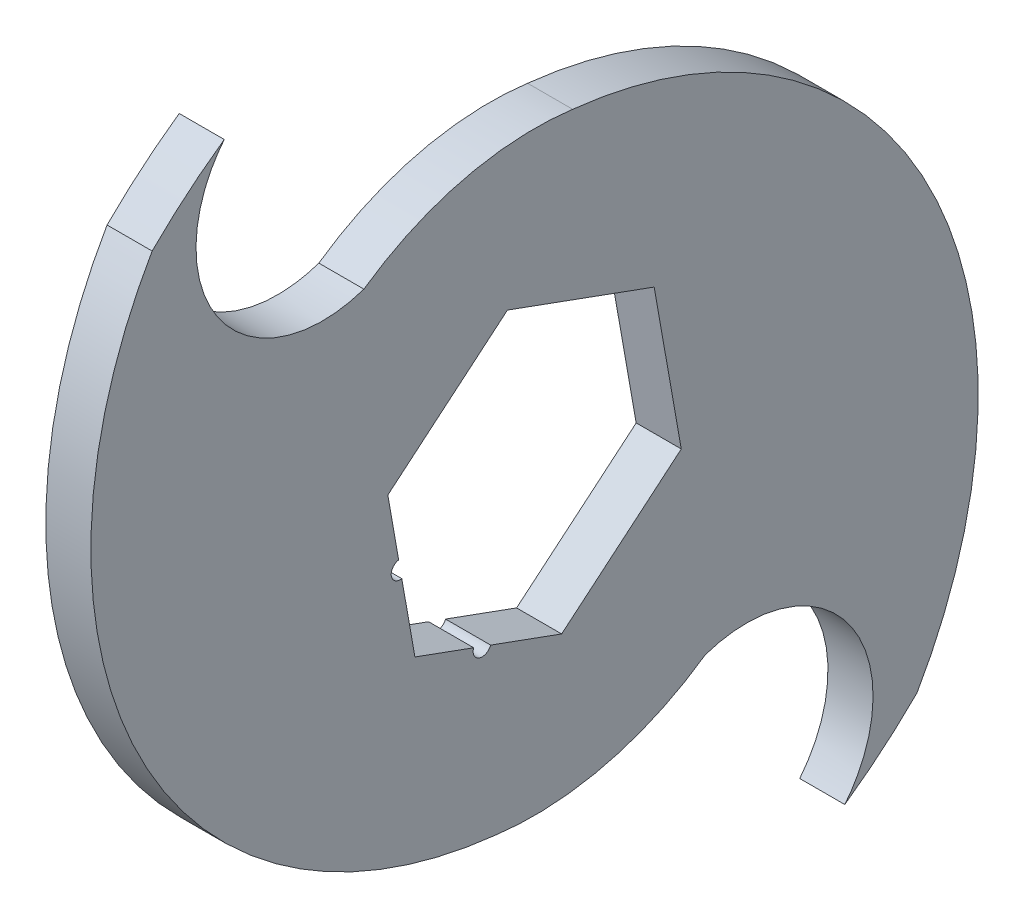
ISO-10303-21;
HEADER;
FILE_DESCRIPTION(('STEP AP214'),'2;1');
FILE_NAME('part.step','',(''),(''),'','','');
FILE_SCHEMA(('AUTOMOTIVE_DESIGN { 1 0 10303 214 1 1 1 1 }'));
ENDSEC;
DATA;
#1=APPLICATION_CONTEXT('core data for automotive mechanical design processes');
#2=APPLICATION_PROTOCOL_DEFINITION('international standard','automotive_design',2000,#1);
#3=PRODUCT_CONTEXT('',#1,'mechanical');
#4=PRODUCT('Part','Part','',(#3));
#5=PRODUCT_RELATED_PRODUCT_CATEGORY('part','',(#4));
#6=PRODUCT_DEFINITION_FORMATION('','',#4);
#7=PRODUCT_DEFINITION_CONTEXT('part definition',#1,'design');
#8=PRODUCT_DEFINITION('design','',#6,#7);
#9=PRODUCT_DEFINITION_SHAPE('','',#8);
#10=(LENGTH_UNIT() NAMED_UNIT(*) SI_UNIT(.MILLI.,.METRE.));
#11=(NAMED_UNIT(*) PLANE_ANGLE_UNIT() SI_UNIT($,.RADIAN.));
#12=(NAMED_UNIT(*) SI_UNIT($,.STERADIAN.) SOLID_ANGLE_UNIT());
#13=UNCERTAINTY_MEASURE_WITH_UNIT(LENGTH_MEASURE(1.E-05),#10,'distance_accuracy_value','');
#14=(GEOMETRIC_REPRESENTATION_CONTEXT(3) GLOBAL_UNCERTAINTY_ASSIGNED_CONTEXT((#13)) GLOBAL_UNIT_ASSIGNED_CONTEXT((#10,
#11,#12)) REPRESENTATION_CONTEXT('',''));
#15=CARTESIAN_POINT('',(0.,0.,0.));
#16=DIRECTION('',(0.,0.,1.));
#17=DIRECTION('',(1.,0.,0.));
#18=AXIS2_PLACEMENT_3D('',#15,#16,#17);
#19=CARTESIAN_POINT('',(-316.000000000001,130.92396265452,176.275953626987));
#20=DIRECTION('',(0.,-0.173648177666925,0.984807753012209));
#21=DIRECTION('',(0.,-0.984807753012209,-0.173648177666925));
#22=AXIS2_PLACEMENT_3D('',#19,#20,#21);
#23=PLANE('',#22);
#24=DIRECTION('',(0.,0.984807753012209,0.173648177666925));
#25=VECTOR('',#24,1.);
#26=CARTESIAN_POINT('',(-316.000000000001,-26.197122930176,148.571267000203));
#27=LINE('',#26,#25);
#28=CARTESIAN_POINT('',(-316.000000000001,113.866592015472,173.268278963379));
#29=VERTEX_POINT('',#28);
#30=CARTESIAN_POINT('',(-316.000000000001,122.122765386099,174.724065086027));
#31=VERTEX_POINT('',#30);
#32=EDGE_CURVE('E189',#29,#31,#27,.T.);
#33=ORIENTED_EDGE('',*,*,#32,.T.);
#34=DIRECTION('',(1.,0.,0.));
#35=VECTOR('',#34,1.);
#36=CARTESIAN_POINT('',(-316.000000000001,122.122765386099,174.724065086027));
#37=LINE('',#36,#35);
#38=CARTESIAN_POINT('',(-311.,122.122765386099,174.724065086027));
#39=VERTEX_POINT('',#38);
#40=EDGE_CURVE('E13',#31,#39,#37,.T.);
#41=ORIENTED_EDGE('',*,*,#40,.T.);
#42=DIRECTION('',(0.,-0.984807753012209,-0.173648177666925));
#43=VECTOR('',#42,1.);
#44=CARTESIAN_POINT('',(-311.,130.92396265452,176.275953626987));
#45=LINE('',#44,#43);
#46=CARTESIAN_POINT('',(-311.,113.866592015472,173.268278963379));
#47=VERTEX_POINT('',#46);
#48=EDGE_CURVE('E210',#39,#47,#45,.T.);
#49=ORIENTED_EDGE('',*,*,#48,.T.);
#50=DIRECTION('',(1.,0.,0.));
#51=VECTOR('',#50,1.);
#52=CARTESIAN_POINT('',(-316.000000000001,113.866592015472,173.268278963379));
#53=LINE('',#52,#51);
#54=EDGE_CURVE('E202',#29,#47,#53,.T.);
#55=ORIENTED_EDGE('',*,*,#54,.F.);
#56=EDGE_LOOP('',(#33,#41,#49,#55));
#57=FACE_BOUND('',#56,.T.);
#58=ADVANCED_FACE('F52',(#57),#23,.F.);
#59=CARTESIAN_POINT('',(-316.000000000001,113.866592015472,173.268278963379));
#60=DIRECTION('',(0.,-0.939692620785907,0.342020143325674));
#61=DIRECTION('',(0.,-0.342020143325674,-0.939692620785907));
#62=AXIS2_PLACEMENT_3D('',#59,#60,#61);
#63=PLANE('',#62);
#64=DIRECTION('',(0.,0.342020143325674,0.939692620785907));
#65=VECTOR('',#64,1.);
#66=CARTESIAN_POINT('',(-316.000000000001,44.8593796082233,-16.3274789050418));
#67=LINE('',#66,#65);
#68=CARTESIAN_POINT('',(-316.000000000001,107.942629360951,156.992325336392));
#69=VERTEX_POINT('',#68);
#70=CARTESIAN_POINT('',(-316.000000000001,110.809968281573,164.870274274724));
#71=VERTEX_POINT('',#70);
#72=EDGE_CURVE('E366',#69,#71,#67,.T.);
#73=ORIENTED_EDGE('',*,*,#72,.T.);
#74=DIRECTION('',(1.,0.,0.));
#75=VECTOR('',#74,1.);
#76=CARTESIAN_POINT('',(-316.000000000001,110.809968281573,164.870274274724));
#77=LINE('',#76,#75);
#78=CARTESIAN_POINT('',(-311.,110.809968281573,164.870274274724));
#79=VERTEX_POINT('',#78);
#80=EDGE_CURVE('E188',#71,#79,#77,.T.);
#81=ORIENTED_EDGE('',*,*,#80,.T.);
#82=DIRECTION('',(0.,-0.342020143325674,-0.939692620785906));
#83=VECTOR('',#82,1.);
#84=CARTESIAN_POINT('',(-311.,113.866592015472,173.268278963379));
#85=LINE('',#84,#83);
#86=CARTESIAN_POINT('',(-311.,107.942629360951,156.992325336392));
#87=VERTEX_POINT('',#86);
#88=EDGE_CURVE('E197',#79,#87,#85,.T.);
#89=ORIENTED_EDGE('',*,*,#88,.T.);
#90=DIRECTION('',(1.,0.,0.));
#91=VECTOR('',#90,1.);
#92=CARTESIAN_POINT('',(-316.000000000001,107.942629360951,156.992325336392));
#93=LINE('',#92,#91);
#94=EDGE_CURVE('E234',#69,#87,#93,.T.);
#95=ORIENTED_EDGE('',*,*,#94,.F.);
#96=EDGE_LOOP('',(#73,#81,#89,#95));
#97=FACE_BOUND('',#96,.T.);
#98=ADVANCED_FACE('F480',(#97),#63,.F.);
#99=CARTESIAN_POINT('',(-316.,93.3772128220975,225.039789292819));
#100=CARTESIAN_POINT('',(-316.,73.0393821844405,109.698220147012));
#101=CARTESIAN_POINT('',(-316.,176.96061781556,210.301779852989));
#102=CARTESIAN_POINT('',(-316.,156.622787177903,94.9602107071821));
#103=(BOUNDED_SURFACE() B_SPLINE_SURFACE(1,1,((#99,#100),(#101,#102)),.UNSPECIFIED.,.F.,.F.,
.F.) B_SPLINE_SURFACE_WITH_KNOTS((2,2),(2,2),(-4.53981220711867,3.94746916711987),
(-5.85604493836555,5.85604493836564),
.UNSPECIFIED.) GEOMETRIC_REPRESENTATION_ITEM() RATIONAL_B_SPLINE_SURFACE(((1.,1.),(1.,1.))) REPRESENTATION_ITEM('') SURFACE());
#104=DIRECTION('',(0.,0.642787609686532,-0.766044443118984));
#105=VECTOR('',#104,1.);
#106=CARTESIAN_POINT('',(-316.000000000001,163.628297991945,137.300444495205));
#107=LINE('',#106,#105);
#108=CARTESIAN_POINT('',(-316.000000000001,130.92396265452,176.275953626987));
#109=VERTEX_POINT('',#108);
#110=CARTESIAN_POINT('',(-316.000000000001,142.057370639048,163.007674663609));
#111=VERTEX_POINT('',#110);
#112=EDGE_CURVE('E456',#109,#111,#107,.T.);
#113=DIRECTION('',(0.,-0.984807753012209,-0.173648177666925));
#114=VECTOR('',#113,1.);
#115=CARTESIAN_POINT('',(-316.000000000001,130.92396265452,176.275953626987));
#116=LINE('',#115,#114);
#117=CARTESIAN_POINT('',(-316.000000000001,124.092380892124,175.071361441361));
#118=VERTEX_POINT('',#117);
#119=EDGE_CURVE('E69',#109,#118,#116,.T.);
#120=CARTESIAN_POINT('',(-316.000000000001,123.107573139112,174.897713263694));
#121=DIRECTION('',(1.,0.,0.));
#122=DIRECTION('',(0.,1.,0.));
#123=AXIS2_PLACEMENT_3D('',#120,#121,#122);
#124=CIRCLE('',#123,0.999999999999998);
#125=EDGE_CURVE('E469',#118,#31,#124,.T.);
#126=DIRECTION('',(0.,-0.342020143325674,-0.939692620785906));
#127=VECTOR('',#126,1.);
#128=CARTESIAN_POINT('',(-316.000000000001,113.866592015472,173.268278963379));
#129=LINE('',#128,#127);
#130=CARTESIAN_POINT('',(-316.000000000001,111.494008568225,166.749659516296));
#131=VERTEX_POINT('',#130);
#132=EDGE_CURVE('E76',#29,#131,#129,.T.);
#133=CARTESIAN_POINT('',(-316.000000000001,111.151988424899,165.80996689551));
#134=DIRECTION('',(1.,0.,0.));
#135=DIRECTION('',(0.,1.,0.));
#136=AXIS2_PLACEMENT_3D('',#133,#134,#135);
#137=CIRCLE('',#136,0.999999999999998);
#138=EDGE_CURVE('E185',#131,#71,#137,.T.);
#139=DIRECTION('',(0.,-0.642787609686533,0.766044443118983));
#140=VECTOR('',#139,1.);
#141=CARTESIAN_POINT('',(-316.000000000001,140.646964698376,118.01681620461));
#142=LINE('',#141,#140);
#143=CARTESIAN_POINT('',(-316.000000000001,119.076037345479,143.724046373014));
#144=VERTEX_POINT('',#143);
#145=EDGE_CURVE('E450',#144,#69,#142,.T.);
#146=DIRECTION('',(0.,-0.984807753012208,-0.17364817766693));
#147=VECTOR('',#146,1.);
#148=CARTESIAN_POINT('',(-316.000000000001,-20.987677600169,119.027034409837));
#149=LINE('',#148,#147);
#150=CARTESIAN_POINT('',(-316.000000000001,136.133407984528,146.731721036622));
#151=VERTEX_POINT('',#150);
#152=EDGE_CURVE('E452',#151,#144,#149,.T.);
#153=DIRECTION('',(0.,-0.342020143325667,-0.939692620785909));
#154=VECTOR('',#153,1.);
#155=CARTESIAN_POINT('',(-316.000000000001,73.050158231801,-26.5880832048116));
#156=LINE('',#155,#154);
#157=EDGE_CURVE('E454',#111,#151,#156,.T.);
#158=CARTESIAN_POINT('',(-316.,92.2723523249579,164.230966515857));
#159=CARTESIAN_POINT('',(-316.,95.1197558353693,191.394339036595));
#160=CARTESIAN_POINT('',(-316.,119.469886618919,203.764773316586));
#161=CARTESIAN_POINT('',(-316.,143.820017402468,216.135207596576));
#162=CARTESIAN_POINT('',(-316.,167.436635888117,202.416175387457));
#163=(BOUNDED_CURVE() B_SPLINE_CURVE(2,(#158,#159,#160,#161,#162),.UNSPECIFIED.,.F.,
.F.) B_SPLINE_CURVE_WITH_KNOTS((3,2,3),(0.,0.996307011316955,1.99261402263391),
.UNSPECIFIED.) CURVE() GEOMETRIC_REPRESENTATION_ITEM() RATIONAL_B_SPLINE_CURVE((1.,
0.878466321854941,1.,0.878466321854941,1.)) REPRESENTATION_ITEM(''));
#164=CARTESIAN_POINT('',(-316.,92.2723523249579,164.230966515857));
#165=VERTEX_POINT('',#164);
#166=CARTESIAN_POINT('',(-316.,167.436635888117,202.416175387457));
#167=VERTEX_POINT('',#166);
#168=EDGE_CURVE('E357',#165,#167,#163,.T.);
#169=CARTESIAN_POINT('',(-316.,167.436635888117,202.416175387457));
#170=CARTESIAN_POINT('',(-316.,171.142417404228,198.708606295157));
#171=CARTESIAN_POINT('',(-316.,174.14912265734,194.414586181064));
#172=(BOUNDED_CURVE() B_SPLINE_CURVE(2,(#169,#170,#171),.UNSPECIFIED.,.F.,
.F.) B_SPLINE_CURVE_WITH_KNOTS((3,3),(-0.959689959281828,-0.785398163397448),
.UNSPECIFIED.) CURVE() GEOMETRIC_REPRESENTATION_ITEM() RATIONAL_B_SPLINE_CURVE((1.,
0.996205198753708,1.)) REPRESENTATION_ITEM(''));
#173=CARTESIAN_POINT('',(-316.,174.14912265734,194.414586181064));
#174=VERTEX_POINT('',#173);
#175=EDGE_CURVE('E294',#167,#174,#172,.T.);
#176=CARTESIAN_POINT('',(-316.,174.14912265734,194.414586181064));
#177=CARTESIAN_POINT('',(-316.,165.924980514249,201.084641941576));
#178=CARTESIAN_POINT('',(-316.,157.251009035956,195.01106172626));
#179=CARTESIAN_POINT('',(-316.,148.577037557664,188.937481510943));
#180=CARTESIAN_POINT('',(-316.,152.032017461537,178.928022399585));
#181=(BOUNDED_CURVE() B_SPLINE_CURVE(2,(#176,#177,#178,#179,#180),.UNSPECIFIED.,.F.,
.F.) B_SPLINE_CURVE_WITH_KNOTS((3,2,3),(-2.5845957593549,-1.29229787967745,0.),
.UNSPECIFIED.) CURVE() GEOMETRIC_REPRESENTATION_ITEM() RATIONAL_B_SPLINE_CURVE((1.,
0.798408498827068,1.,0.798408498827074,1.)) REPRESENTATION_ITEM(''));
#182=CARTESIAN_POINT('',(-316.,152.032017461537,178.928022399585));
#183=VERTEX_POINT('',#182);
#184=EDGE_CURVE('E285',#174,#183,#181,.T.);
#185=CARTESIAN_POINT('',(-316.,152.032017461537,178.928022399585));
#186=CARTESIAN_POINT('',(-316.,159.367297201495,168.452157260068));
#187=CARTESIAN_POINT('',(-316.,157.727647675044,155.769033484153));
#188=(BOUNDED_CURVE() B_SPLINE_CURVE(2,(#185,#186,#187),.UNSPECIFIED.,.F.,
.F.) B_SPLINE_CURVE_WITH_KNOTS((3,3),(-0.785398163397448,-0.0459679370742319),
.UNSPECIFIED.) CURVE() GEOMETRIC_REPRESENTATION_ITEM() RATIONAL_B_SPLINE_CURVE((1.,
0.932430327247687,1.)) REPRESENTATION_ITEM(''));
#189=CARTESIAN_POINT('',(-316.,157.727647675044,155.769033484153));
#190=VERTEX_POINT('',#189);
#191=EDGE_CURVE('E284',#183,#190,#188,.T.);
#192=CARTESIAN_POINT('',(-315.999999999999,157.727647675044,155.769033484153));
#193=CARTESIAN_POINT('',(-315.999999999999,154.880244164636,128.605660963411));
#194=CARTESIAN_POINT('',(-316.,130.530113381086,116.235226683418));
#195=CARTESIAN_POINT('',(-316.,106.179982597535,103.864792403424));
#196=CARTESIAN_POINT('',(-316.000000000001,82.5633641118844,117.583824612545));
#197=(BOUNDED_CURVE() B_SPLINE_CURVE(2,(#192,#193,#194,#195,#196),.UNSPECIFIED.,.F.,
.F.) B_SPLINE_CURVE_WITH_KNOTS((3,2,3),(-1.53135584032607E-13,0.996307011316879,
1.99261402263391),
.UNSPECIFIED.) CURVE() GEOMETRIC_REPRESENTATION_ITEM() RATIONAL_B_SPLINE_CURVE((1.,
0.878466321854923,1.,0.878466321854924,1.)) REPRESENTATION_ITEM(''));
#198=CARTESIAN_POINT('',(-316.,82.5633641118844,117.583824612545));
#199=VERTEX_POINT('',#198);
#200=EDGE_CURVE('E265',#190,#199,#197,.T.);
#201=CARTESIAN_POINT('',(-316.000000000001,82.5633641118844,117.583824612545));
#202=CARTESIAN_POINT('',(-316.000000000001,78.8575825957731,121.291393704845));
#203=CARTESIAN_POINT('',(-316.000000000001,75.8508773426607,125.585413818938));
#204=(BOUNDED_CURVE() B_SPLINE_CURVE(2,(#201,#202,#203),.UNSPECIFIED.,.F.,
.F.) B_SPLINE_CURVE_WITH_KNOTS((3,3),(-0.959689959281827,-0.785398163397448),
.UNSPECIFIED.) CURVE() GEOMETRIC_REPRESENTATION_ITEM() RATIONAL_B_SPLINE_CURVE((1.,
0.996205198753625,1.)) REPRESENTATION_ITEM(''));
#205=CARTESIAN_POINT('',(-316.,75.8508773426607,125.585413818938));
#206=VERTEX_POINT('',#205);
#207=EDGE_CURVE('E244',#199,#206,#204,.T.);
#208=CARTESIAN_POINT('',(-316.000000000001,75.8508773426607,125.585413818938));
#209=CARTESIAN_POINT('',(-316.000000000001,84.0750194857523,118.915358058425));
#210=CARTESIAN_POINT('',(-316.000000000001,92.7489909640453,124.988938273742));
#211=CARTESIAN_POINT('',(-316.,101.422962442337,131.062518489058));
#212=CARTESIAN_POINT('',(-316.,97.967982538464,141.071977600416));
#213=(BOUNDED_CURVE() B_SPLINE_CURVE(2,(#208,#209,#210,#211,#212),.UNSPECIFIED.,.F.,
.F.) B_SPLINE_CURVE_WITH_KNOTS((3,2,3),(-2.5845957593549,-1.29229787967746,0.),
.UNSPECIFIED.) CURVE() GEOMETRIC_REPRESENTATION_ITEM() RATIONAL_B_SPLINE_CURVE((1.,
0.798408498827071,1.,0.798408498827066,1.)) REPRESENTATION_ITEM(''));
#214=CARTESIAN_POINT('',(-316.,97.967982538464,141.071977600416));
#215=VERTEX_POINT('',#214);
#216=EDGE_CURVE('E238',#206,#215,#213,.T.);
#217=CARTESIAN_POINT('',(-316.,97.967982538464,141.071977600416));
#218=CARTESIAN_POINT('',(-316.,90.6327027985029,151.547842739937));
#219=CARTESIAN_POINT('',(-316.,92.2723523249579,164.230966515857));
#220=(BOUNDED_CURVE() B_SPLINE_CURVE(2,(#217,#218,#219),.UNSPECIFIED.,.F.,
.F.) B_SPLINE_CURVE_WITH_KNOTS((3,3),(2.35619449019233,3.09562471651579),
.UNSPECIFIED.) CURVE() GEOMETRIC_REPRESENTATION_ITEM() RATIONAL_B_SPLINE_CURVE((1.,
0.932430327247634,1.)) REPRESENTATION_ITEM(''));
#221=EDGE_CURVE('E245',#215,#165,#220,.T.);
#222=ORIENTED_EDGE('',*,*,#112,.F.);
#223=ORIENTED_EDGE('',*,*,#119,.T.);
#224=ORIENTED_EDGE('',*,*,#125,.T.);
#225=ORIENTED_EDGE('',*,*,#32,.F.);
#226=ORIENTED_EDGE('',*,*,#132,.T.);
#227=ORIENTED_EDGE('',*,*,#138,.T.);
#228=ORIENTED_EDGE('',*,*,#72,.F.);
#229=ORIENTED_EDGE('',*,*,#145,.F.);
#230=ORIENTED_EDGE('',*,*,#152,.F.);
#231=ORIENTED_EDGE('',*,*,#157,.F.);
#232=EDGE_LOOP('',(#222,#223,#224,#225,#226,#227,#228,#229,#230,#231));
#233=FACE_BOUND('',#232,.T.);
#234=ORIENTED_EDGE('',*,*,#168,.T.);
#235=ORIENTED_EDGE('',*,*,#175,.T.);
#236=ORIENTED_EDGE('',*,*,#184,.T.);
#237=ORIENTED_EDGE('',*,*,#191,.T.);
#238=ORIENTED_EDGE('',*,*,#200,.T.);
#239=ORIENTED_EDGE('',*,*,#207,.T.);
#240=ORIENTED_EDGE('',*,*,#216,.T.);
#241=ORIENTED_EDGE('',*,*,#221,.T.);
#242=EDGE_LOOP('',(#234,#235,#236,#237,#238,#239,#240,#241));
#243=FACE_BOUND('',#242,.T.);
#244=ADVANCED_FACE('F475',(#233,#243),#103,.T.);
#245=CARTESIAN_POINT('',(-311.,176.96061781556,210.301779852989));
#246=CARTESIAN_POINT('',(-311.,156.622787177903,94.9602107071829));
#247=CARTESIAN_POINT('',(-311.,93.3772128220975,225.039789292819));
#248=CARTESIAN_POINT('',(-311.,73.0393821844406,109.698220147013));
#249=(BOUNDED_SURFACE() B_SPLINE_SURFACE(1,1,((#245,#246),(#247,#248)),.UNSPECIFIED.,.F.,.F.,
.F.) B_SPLINE_SURFACE_WITH_KNOTS((2,2),(2,2),(-4.53981220711868,3.94746916711987),
(-5.85604493836555,5.85604493836555),
.UNSPECIFIED.) GEOMETRIC_REPRESENTATION_ITEM() RATIONAL_B_SPLINE_SURFACE(((1.,1.),(1.,1.))) REPRESENTATION_ITEM('') SURFACE());
#250=CARTESIAN_POINT('',(-311.,111.494008568225,166.749659516296));
#251=VERTEX_POINT('',#250);
#252=EDGE_CURVE('E194',#47,#251,#85,.T.);
#253=CARTESIAN_POINT('',(-311.,123.107573139112,174.897713263694));
#254=DIRECTION('',(1.,0.,0.));
#255=DIRECTION('',(0.,1.,0.));
#256=AXIS2_PLACEMENT_3D('',#253,#254,#255);
#257=CIRCLE('',#256,0.999999999999998);
#258=CARTESIAN_POINT('',(-311.,124.092380892124,175.071361441361));
#259=VERTEX_POINT('',#258);
#260=EDGE_CURVE('E468',#259,#39,#257,.T.);
#261=CARTESIAN_POINT('',(-311.,130.92396265452,176.275953626987));
#262=VERTEX_POINT('',#261);
#263=EDGE_CURVE('E208',#262,#259,#45,.T.);
#264=DIRECTION('',(0.,-0.642787609686532,0.766044443118984));
#265=VECTOR('',#264,1.);
#266=CARTESIAN_POINT('',(-311.,142.057370639048,163.007674663609));
#267=LINE('',#266,#265);
#268=CARTESIAN_POINT('',(-311.,142.057370639048,163.007674663609));
#269=VERTEX_POINT('',#268);
#270=EDGE_CURVE('E218',#269,#262,#267,.T.);
#271=DIRECTION('',(0.,0.342020143325667,0.939692620785909));
#272=VECTOR('',#271,1.);
#273=CARTESIAN_POINT('',(-311.,136.133407984528,146.731721036622));
#274=LINE('',#273,#272);
#275=CARTESIAN_POINT('',(-311.,136.133407984528,146.731721036622));
#276=VERTEX_POINT('',#275);
#277=EDGE_CURVE('E215',#276,#269,#274,.T.);
#278=DIRECTION('',(0.,0.984807753012208,0.17364817766693));
#279=VECTOR('',#278,1.);
#280=CARTESIAN_POINT('',(-311.,119.076037345479,143.724046373014));
#281=LINE('',#280,#279);
#282=CARTESIAN_POINT('',(-311.,119.076037345479,143.724046373014));
#283=VERTEX_POINT('',#282);
#284=EDGE_CURVE('E206',#283,#276,#281,.T.);
#285=DIRECTION('',(0.,0.642787609686533,-0.766044443118983));
#286=VECTOR('',#285,1.);
#287=CARTESIAN_POINT('',(-311.,107.942629360951,156.992325336392));
#288=LINE('',#287,#286);
#289=EDGE_CURVE('E203',#87,#283,#288,.T.);
#290=CARTESIAN_POINT('',(-311.,111.151988424899,165.80996689551));
#291=DIRECTION('',(1.,0.,0.));
#292=DIRECTION('',(0.,1.,0.));
#293=AXIS2_PLACEMENT_3D('',#290,#291,#292);
#294=CIRCLE('',#293,0.999999999999998);
#295=EDGE_CURVE('E183',#251,#79,#294,.T.);
#296=CARTESIAN_POINT('',(-311.,152.032017461537,178.928022399585));
#297=CARTESIAN_POINT('',(-311.,148.577037557664,188.937481510943));
#298=CARTESIAN_POINT('',(-311.,157.251009035956,195.01106172626));
#299=CARTESIAN_POINT('',(-311.,165.924980514249,201.084641941576));
#300=CARTESIAN_POINT('',(-311.,174.14912265734,194.414586181064));
#301=(BOUNDED_CURVE() B_SPLINE_CURVE(2,(#296,#297,#298,#299,#300),.UNSPECIFIED.,.F.,
.F.) B_SPLINE_CURVE_WITH_KNOTS((3,2,3),(0.,1.29229787967745,2.5845957593549),
.UNSPECIFIED.) CURVE() GEOMETRIC_REPRESENTATION_ITEM() RATIONAL_B_SPLINE_CURVE((1.,
0.798408498827073,1.,0.798408498827067,1.)) REPRESENTATION_ITEM(''));
#302=CARTESIAN_POINT('',(-311.,152.032017461537,178.928022399585));
#303=VERTEX_POINT('',#302);
#304=CARTESIAN_POINT('',(-311.,174.14912265734,194.414586181064));
#305=VERTEX_POINT('',#304);
#306=EDGE_CURVE('E266',#303,#305,#301,.T.);
#307=CARTESIAN_POINT('',(-311.,167.436635888117,202.416175387457));
#308=CARTESIAN_POINT('',(-311.,171.142417404228,198.708606295157));
#309=CARTESIAN_POINT('',(-311.,174.14912265734,194.414586181064));
#310=(BOUNDED_CURVE() B_SPLINE_CURVE(2,(#307,#308,#309),.UNSPECIFIED.,.F.,
.F.) B_SPLINE_CURVE_WITH_KNOTS((3,3),(-0.959689959281828,-0.785398163397448),
.UNSPECIFIED.) CURVE() GEOMETRIC_REPRESENTATION_ITEM() RATIONAL_B_SPLINE_CURVE((1.,
0.996205198753708,1.)) REPRESENTATION_ITEM(''));
#311=CARTESIAN_POINT('',(-311.,167.436635888117,202.416175387457));
#312=VERTEX_POINT('',#311);
#313=EDGE_CURVE('E330',#312,#305,#310,.T.);
#314=CARTESIAN_POINT('',(-311.,92.2723523249579,164.230966515857));
#315=CARTESIAN_POINT('',(-311.,95.1197558353693,191.394339036595));
#316=CARTESIAN_POINT('',(-311.,119.469886618919,203.764773316586));
#317=CARTESIAN_POINT('',(-311.,143.820017402468,216.135207596576));
#318=CARTESIAN_POINT('',(-311.,167.436635888117,202.416175387457));
#319=(BOUNDED_CURVE() B_SPLINE_CURVE(2,(#314,#315,#316,#317,#318),.UNSPECIFIED.,.F.,
.F.) B_SPLINE_CURVE_WITH_KNOTS((3,2,3),(0.,0.996307011316955,1.99261402263391),
.UNSPECIFIED.) CURVE() GEOMETRIC_REPRESENTATION_ITEM() RATIONAL_B_SPLINE_CURVE((1.,
0.878466321854941,1.,0.878466321854941,1.)) REPRESENTATION_ITEM(''));
#320=CARTESIAN_POINT('',(-311.,92.2723523249579,164.230966515857));
#321=VERTEX_POINT('',#320);
#322=EDGE_CURVE('E295',#321,#312,#319,.T.);
#323=CARTESIAN_POINT('',(-311.,97.9679825384637,141.071977600416));
#324=CARTESIAN_POINT('',(-311.,90.6327027985031,151.547842739937));
#325=CARTESIAN_POINT('',(-311.,92.2723523249579,164.230966515857));
#326=(BOUNDED_CURVE() B_SPLINE_CURVE(2,(#323,#324,#325),.UNSPECIFIED.,.F.,
.F.) B_SPLINE_CURVE_WITH_KNOTS((3,3),(2.35619449019234,3.09562471651579),
.UNSPECIFIED.) CURVE() GEOMETRIC_REPRESENTATION_ITEM() RATIONAL_B_SPLINE_CURVE((1.,
0.932430327247639,1.)) REPRESENTATION_ITEM(''));
#327=CARTESIAN_POINT('',(-311.,97.9679825384638,141.071977600416));
#328=VERTEX_POINT('',#327);
#329=EDGE_CURVE('E256',#328,#321,#326,.T.);
#330=CARTESIAN_POINT('',(-311.,97.9679825384638,141.071977600416));
#331=CARTESIAN_POINT('',(-311.,101.422962442337,131.062518489058));
#332=CARTESIAN_POINT('',(-311.,92.7489909640453,124.988938273742));
#333=CARTESIAN_POINT('',(-311.,84.0750194857524,118.915358058425));
#334=CARTESIAN_POINT('',(-311.000000000001,75.8508773426607,125.585413818938));
#335=(BOUNDED_CURVE() B_SPLINE_CURVE(2,(#330,#331,#332,#333,#334),.UNSPECIFIED.,.F.,
.F.) B_SPLINE_CURVE_WITH_KNOTS((3,2,3),(0.,1.29229787967745,2.5845957593549),
.UNSPECIFIED.) CURVE() GEOMETRIC_REPRESENTATION_ITEM() RATIONAL_B_SPLINE_CURVE((1.,
0.798408498827074,1.,0.79840849882707,1.)) REPRESENTATION_ITEM(''));
#336=CARTESIAN_POINT('',(-311.000000000001,75.8508773426607,125.585413818938));
#337=VERTEX_POINT('',#336);
#338=EDGE_CURVE('E275',#328,#337,#335,.T.);
#339=CARTESIAN_POINT('',(-311.,82.5633641118844,117.583824612545));
#340=CARTESIAN_POINT('',(-311.000000000001,78.8575825957729,121.291393704845));
#341=CARTESIAN_POINT('',(-311.000000000001,75.8508773426607,125.585413818938));
#342=(BOUNDED_CURVE() B_SPLINE_CURVE(2,(#339,#340,#341),.UNSPECIFIED.,.F.,
.F.) B_SPLINE_CURVE_WITH_KNOTS((3,3),(-0.959689959281828,-0.785398163397448),
.UNSPECIFIED.) CURVE() GEOMETRIC_REPRESENTATION_ITEM() RATIONAL_B_SPLINE_CURVE((1.,
0.996205198753724,1.)) REPRESENTATION_ITEM(''));
#343=CARTESIAN_POINT('',(-311.,82.5633641118844,117.583824612545));
#344=VERTEX_POINT('',#343);
#345=EDGE_CURVE('E341',#344,#337,#342,.T.);
#346=CARTESIAN_POINT('',(-310.999999999999,157.727647675043,155.769033484145));
#347=CARTESIAN_POINT('',(-310.999999999999,154.880244164631,128.605660963407));
#348=CARTESIAN_POINT('',(-310.999999999999,130.530113381082,116.235226683416));
#349=CARTESIAN_POINT('',(-311.,106.179982597533,103.864792403426));
#350=CARTESIAN_POINT('',(-311.,82.5633641118844,117.583824612545));
#351=(BOUNDED_CURVE() B_SPLINE_CURVE(2,(#346,#347,#348,#349,#350),.UNSPECIFIED.,.F.,
.F.) B_SPLINE_CURVE_WITH_KNOTS((3,2,3),(0.,0.996307011316955,1.99261402263391),
.UNSPECIFIED.) CURVE() GEOMETRIC_REPRESENTATION_ITEM() RATIONAL_B_SPLINE_CURVE((1.,
0.878466321854942,1.,0.878466321854944,1.)) REPRESENTATION_ITEM(''));
#352=CARTESIAN_POINT('',(-310.999999999999,157.727647675043,155.769033484145));
#353=VERTEX_POINT('',#352);
#354=EDGE_CURVE('E389',#353,#344,#351,.T.);
#355=CARTESIAN_POINT('',(-311.,152.032017461537,178.928022399585));
#356=CARTESIAN_POINT('',(-311.,159.367297201498,168.452157260065));
#357=CARTESIAN_POINT('',(-311.,157.727647675043,155.769033484145));
#358=(BOUNDED_CURVE() B_SPLINE_CURVE(2,(#355,#356,#357),.UNSPECIFIED.,.F.,
.F.) B_SPLINE_CURVE_WITH_KNOTS((3,3),(-0.785398163397448,-0.0459679370739997),
.UNSPECIFIED.) CURVE() GEOMETRIC_REPRESENTATION_ITEM() RATIONAL_B_SPLINE_CURVE((1.,
0.932430327247638,1.)) REPRESENTATION_ITEM(''));
#359=EDGE_CURVE('E340',#303,#353,#358,.T.);
#360=ORIENTED_EDGE('',*,*,#252,.F.);
#361=ORIENTED_EDGE('',*,*,#48,.F.);
#362=ORIENTED_EDGE('',*,*,#260,.F.);
#363=ORIENTED_EDGE('',*,*,#263,.F.);
#364=ORIENTED_EDGE('',*,*,#270,.F.);
#365=ORIENTED_EDGE('',*,*,#277,.F.);
#366=ORIENTED_EDGE('',*,*,#284,.F.);
#367=ORIENTED_EDGE('',*,*,#289,.F.);
#368=ORIENTED_EDGE('',*,*,#88,.F.);
#369=ORIENTED_EDGE('',*,*,#295,.F.);
#370=EDGE_LOOP('',(#360,#361,#362,#363,#364,#365,#366,#367,#368,#369));
#371=FACE_BOUND('',#370,.T.);
#372=ORIENTED_EDGE('',*,*,#306,.T.);
#373=ORIENTED_EDGE('',*,*,#313,.F.);
#374=ORIENTED_EDGE('',*,*,#322,.F.);
#375=ORIENTED_EDGE('',*,*,#329,.F.);
#376=ORIENTED_EDGE('',*,*,#338,.T.);
#377=ORIENTED_EDGE('',*,*,#345,.F.);
#378=ORIENTED_EDGE('',*,*,#354,.F.);
#379=ORIENTED_EDGE('',*,*,#359,.F.);
#380=EDGE_LOOP('',(#372,#373,#374,#375,#376,#377,#378,#379));
#381=FACE_BOUND('',#380,.T.);
#382=ADVANCED_FACE('F192',(#371,#381),#249,.T.);
#383=CARTESIAN_POINT('',(-311.,97.9679825384638,141.071977600416));
#384=CARTESIAN_POINT('',(-311.,101.422962442337,131.062518489059));
#385=CARTESIAN_POINT('',(-311.,92.7489909640453,124.988938273742));
#386=CARTESIAN_POINT('',(-311.,84.0750194857523,118.915358058425));
#387=CARTESIAN_POINT('',(-311.000000000001,75.8508773426607,125.585413818938));
#388=CARTESIAN_POINT('',(-316.000000000001,97.9679825384639,141.071977600416));
#389=CARTESIAN_POINT('',(-316.,101.422962442338,131.062518489059));
#390=CARTESIAN_POINT('',(-316.000000000001,92.7489909640453,124.988938273742));
#391=CARTESIAN_POINT('',(-316.000000000001,84.0750194857523,118.915358058425));
#392=CARTESIAN_POINT('',(-316.000000000001,75.8508773426607,125.585413818938));
#393=(BOUNDED_SURFACE() B_SPLINE_SURFACE(1,2,((#383,#384,#385,#386,#387),(#388,#389,#390,#391,
#392)),.UNSPECIFIED.,.F.,.F.,.F.) B_SPLINE_SURFACE_WITH_KNOTS((2,2),(3,2,3),(0.,
0.356099747166173),(0.,1.29229787967745,2.5845957593549),
.UNSPECIFIED.) GEOMETRIC_REPRESENTATION_ITEM() RATIONAL_B_SPLINE_SURFACE(((1.,0.798408498827072,
1.,0.798408498827072,1.),(1.,0.798408498827072,1.,0.798408498827072,1.))) REPRESENTATION_ITEM('') SURFACE());
#394=CARTESIAN_POINT('',(-316.,97.967982538464,141.071977600416));
#395=CARTESIAN_POINT('',(-311.,97.9679825384639,141.071977600416));
#396=(BOUNDED_CURVE() B_SPLINE_CURVE(1,(#394,#395),.UNSPECIFIED.,.F.,
.F.) B_SPLINE_CURVE_WITH_KNOTS((2,2),(-0.499999999999937,0.),
.UNSPECIFIED.) CURVE() GEOMETRIC_REPRESENTATION_ITEM() RATIONAL_B_SPLINE_CURVE((1.,1.)) REPRESENTATION_ITEM(''));
#397=EDGE_CURVE('E246',#215,#328,#396,.T.);
#398=CARTESIAN_POINT('',(-311.000000000001,75.8508773426607,125.585413818938));
#399=CARTESIAN_POINT('',(-316.,75.8508773426607,125.585413818938));
#400=(BOUNDED_CURVE() B_SPLINE_CURVE(1,(#398,#399),.UNSPECIFIED.,.F.,
.F.) B_SPLINE_CURVE_WITH_KNOTS((2,2),(0.,0.499999999999922),
.UNSPECIFIED.) CURVE() GEOMETRIC_REPRESENTATION_ITEM() RATIONAL_B_SPLINE_CURVE((1.,1.)) REPRESENTATION_ITEM(''));
#401=EDGE_CURVE('E349',#337,#206,#400,.T.);
#402=ORIENTED_EDGE('',*,*,#338,.F.);
#403=ORIENTED_EDGE('',*,*,#397,.F.);
#404=ORIENTED_EDGE('',*,*,#216,.F.);
#405=ORIENTED_EDGE('',*,*,#401,.F.);
#406=EDGE_LOOP('',(#402,#403,#404,#405));
#407=FACE_BOUND('',#406,.T.);
#408=ADVANCED_FACE('F519',(#407),#393,.T.);
#409=CARTESIAN_POINT('',(-316.000000000001,82.5633641118844,117.583824612545));
#410=CARTESIAN_POINT('',(-316.000000000001,78.8575825957731,121.291393704845));
#411=CARTESIAN_POINT('',(-316.000000000001,75.8508773426607,125.585413818938));
#412=CARTESIAN_POINT('',(-311.,82.5633641118844,117.583824612545));
#413=CARTESIAN_POINT('',(-311.000000000001,78.8575825957731,121.291393704845));
#414=CARTESIAN_POINT('',(-311.000000000001,75.8508773426607,125.585413818938));
#415=(BOUNDED_SURFACE() B_SPLINE_SURFACE(1,2,((#409,#410,#411),(#412,#413,#414)),.UNSPECIFIED.,
.F.,.F.,.F.) B_SPLINE_SURFACE_WITH_KNOTS((2,2),(3,3),(0.,0.0833333333333376),
(-0.959689959281828,-0.785398163397448),
.UNSPECIFIED.) GEOMETRIC_REPRESENTATION_ITEM() RATIONAL_B_SPLINE_SURFACE(((1.,0.996205198753734,
1.),(1.,0.996205198753734,1.))) REPRESENTATION_ITEM('') SURFACE());
#416=CARTESIAN_POINT('',(-311.,82.5633641118844,117.583824612545));
#417=CARTESIAN_POINT('',(-316.,82.5633641118844,117.583824612545));
#418=(BOUNDED_CURVE() B_SPLINE_CURVE(1,(#416,#417),.UNSPECIFIED.,.F.,
.F.) B_SPLINE_CURVE_WITH_KNOTS((2,2),(0.,0.499999999999942),
.UNSPECIFIED.) CURVE() GEOMETRIC_REPRESENTATION_ITEM() RATIONAL_B_SPLINE_CURVE((1.,1.)) REPRESENTATION_ITEM(''));
#419=EDGE_CURVE('E255',#344,#199,#418,.T.);
#420=ORIENTED_EDGE('',*,*,#345,.T.);
#421=ORIENTED_EDGE('',*,*,#401,.T.);
#422=ORIENTED_EDGE('',*,*,#207,.F.);
#423=ORIENTED_EDGE('',*,*,#419,.F.);
#424=EDGE_LOOP('',(#420,#421,#422,#423));
#425=FACE_BOUND('',#424,.T.);
#426=ADVANCED_FACE('F513',(#425),#415,.T.);
#427=CARTESIAN_POINT('',(-316.,157.727647675043,155.769033484145));
#428=CARTESIAN_POINT('',(-316.,154.880244164634,128.605660963408));
#429=CARTESIAN_POINT('',(-316.,130.530113381086,116.235226683418));
#430=CARTESIAN_POINT('',(-316.000000000001,106.179982597535,103.864792403424));
#431=CARTESIAN_POINT('',(-316.000000000001,82.5633641118844,117.583824612545));
#432=CARTESIAN_POINT('',(-310.999999999999,157.727647675043,155.769033484145));
#433=CARTESIAN_POINT('',(-310.999999999999,154.880244164634,128.605660963408));
#434=CARTESIAN_POINT('',(-310.999999999999,130.530113381086,116.235226683418));
#435=CARTESIAN_POINT('',(-311.,106.179982597535,103.864792403425));
#436=CARTESIAN_POINT('',(-311.,82.5633641118844,117.583824612545));
#437=(BOUNDED_SURFACE() B_SPLINE_SURFACE(1,2,((#427,#428,#429,#430,#431),(#432,#433,#434,#435,
#436)),.UNSPECIFIED.,.F.,.F.,.F.) B_SPLINE_SURFACE_WITH_KNOTS((2,2),(3,2,3),(0.,
0.0995722131682843),(-1.53163372367968E-13,0.996307011316809,1.99261402263391),
.UNSPECIFIED.) GEOMETRIC_REPRESENTATION_ITEM() RATIONAL_B_SPLINE_SURFACE(((1.,0.878466321854922,
1.,0.878466321854922,1.),(1.,0.878466321854922,1.,0.878466321854922,1.))) REPRESENTATION_ITEM('') SURFACE());
#438=CARTESIAN_POINT('',(-310.999999999999,157.727647675044,155.769033484153));
#439=CARTESIAN_POINT('',(-316.,157.727647675044,155.769033484153));
#440=(BOUNDED_CURVE() B_SPLINE_CURVE(1,(#438,#439),.UNSPECIFIED.,.F.,
.F.) B_SPLINE_CURVE_WITH_KNOTS((2,2),(-1.08985285860551E-13,0.499999999999964),
.UNSPECIFIED.) CURVE() GEOMETRIC_REPRESENTATION_ITEM() RATIONAL_B_SPLINE_CURVE((1.,1.)) REPRESENTATION_ITEM(''));
#441=EDGE_CURVE('E321',#353,#190,#440,.T.);
#442=ORIENTED_EDGE('',*,*,#354,.T.);
#443=ORIENTED_EDGE('',*,*,#419,.T.);
#444=ORIENTED_EDGE('',*,*,#200,.F.);
#445=ORIENTED_EDGE('',*,*,#441,.F.);
#446=EDGE_LOOP('',(#442,#443,#444,#445));
#447=FACE_BOUND('',#446,.T.);
#448=ADVANCED_FACE('F518',(#447),#437,.T.);
#449=CARTESIAN_POINT('',(-316.,97.967982538464,141.071977600416));
#450=CARTESIAN_POINT('',(-316.,90.6327027985029,151.547842739937));
#451=CARTESIAN_POINT('',(-316.,92.2723523249579,164.230966515857));
#452=CARTESIAN_POINT('',(-311.,97.967982538464,141.071977600416));
#453=CARTESIAN_POINT('',(-311.,90.6327027985029,151.547842739937));
#454=CARTESIAN_POINT('',(-311.,92.2723523249579,164.230966515857));
#455=(BOUNDED_SURFACE() B_SPLINE_SURFACE(1,2,((#449,#450,#451),(#452,#453,#454)),.UNSPECIFIED.,
.F.,.F.,.F.) B_SPLINE_SURFACE_WITH_KNOTS((2,2),(3,3),(0.,0.151515151515152),(2.35619449019233,
3.09562471651579),.UNSPECIFIED.) GEOMETRIC_REPRESENTATION_ITEM() RATIONAL_B_SPLINE_SURFACE(((1.,
0.932430327247641,1.),(1.,0.932430327247641,1.))) REPRESENTATION_ITEM('') SURFACE());
#456=CARTESIAN_POINT('',(-311.,92.2723523249579,164.230966515857));
#457=CARTESIAN_POINT('',(-316.,92.2723523249579,164.230966515857));
#458=(BOUNDED_CURVE() B_SPLINE_CURVE(1,(#456,#457),.UNSPECIFIED.,.F.,
.F.) B_SPLINE_CURVE_WITH_KNOTS((2,2),(0.,0.5),
.UNSPECIFIED.) CURVE() GEOMETRIC_REPRESENTATION_ITEM() RATIONAL_B_SPLINE_CURVE((1.,1.)) REPRESENTATION_ITEM(''));
#459=EDGE_CURVE('E312',#321,#165,#458,.T.);
#460=ORIENTED_EDGE('',*,*,#397,.T.);
#461=ORIENTED_EDGE('',*,*,#329,.T.);
#462=ORIENTED_EDGE('',*,*,#459,.T.);
#463=ORIENTED_EDGE('',*,*,#221,.F.);
#464=EDGE_LOOP('',(#460,#461,#462,#463));
#465=FACE_BOUND('',#464,.T.);
#466=ADVANCED_FACE('F552',(#465),#455,.T.);
#467=CARTESIAN_POINT('',(-316.,152.032017461537,178.928022399585));
#468=CARTESIAN_POINT('',(-316.,159.367297201498,168.452157260065));
#469=CARTESIAN_POINT('',(-316.,157.727647675043,155.769033484145));
#470=CARTESIAN_POINT('',(-310.999999999999,152.032017461537,178.928022399585));
#471=CARTESIAN_POINT('',(-310.999999999999,159.367297201498,168.452157260065));
#472=CARTESIAN_POINT('',(-310.999999999999,157.727647675043,155.769033484145));
#473=(BOUNDED_SURFACE() B_SPLINE_SURFACE(1,2,((#467,#468,#469),(#470,#471,#472)),.UNSPECIFIED.,
.F.,.F.,.F.) B_SPLINE_SURFACE_WITH_KNOTS((2,2),(3,3),(0.,0.151515151515152),(-0.785398163397448,
-0.0459679370739997),
.UNSPECIFIED.) GEOMETRIC_REPRESENTATION_ITEM() RATIONAL_B_SPLINE_SURFACE(((1.,0.932430327247644,
1.),(1.,0.932430327247644,1.))) REPRESENTATION_ITEM('') SURFACE());
#474=CARTESIAN_POINT('',(-311.,152.032017461537,178.928022399585));
#475=CARTESIAN_POINT('',(-316.,152.032017461537,178.928022399585));
#476=(BOUNDED_CURVE() B_SPLINE_CURVE(1,(#474,#475),.UNSPECIFIED.,.F.,
.F.) B_SPLINE_CURVE_WITH_KNOTS((2,2),(0.,0.5),
.UNSPECIFIED.) CURVE() GEOMETRIC_REPRESENTATION_ITEM() RATIONAL_B_SPLINE_CURVE((1.,1.)) REPRESENTATION_ITEM(''));
#477=EDGE_CURVE('E331',#303,#183,#476,.T.);
#478=ORIENTED_EDGE('',*,*,#441,.T.);
#479=ORIENTED_EDGE('',*,*,#191,.F.);
#480=ORIENTED_EDGE('',*,*,#477,.F.);
#481=ORIENTED_EDGE('',*,*,#359,.T.);
#482=EDGE_LOOP('',(#478,#479,#480,#481));
#483=FACE_BOUND('',#482,.T.);
#484=ADVANCED_FACE('F531',(#483),#473,.T.);
#485=CARTESIAN_POINT('',(-311.,152.032017461537,178.928022399585));
#486=CARTESIAN_POINT('',(-311.,148.577037557664,188.937481510943));
#487=CARTESIAN_POINT('',(-311.,157.251009035956,195.01106172626));
#488=CARTESIAN_POINT('',(-311.,165.924980514249,201.084641941576));
#489=CARTESIAN_POINT('',(-311.,174.14912265734,194.414586181064));
#490=CARTESIAN_POINT('',(-316.,152.032017461537,178.928022399585));
#491=CARTESIAN_POINT('',(-316.,148.577037557664,188.937481510943));
#492=CARTESIAN_POINT('',(-316.,157.251009035956,195.01106172626));
#493=CARTESIAN_POINT('',(-316.,165.924980514249,201.084641941576));
#494=CARTESIAN_POINT('',(-316.,174.14912265734,194.414586181064));
#495=(BOUNDED_SURFACE() B_SPLINE_SURFACE(1,2,((#485,#486,#487,#488,#489),(#490,#491,#492,#493,
#494)),.UNSPECIFIED.,.F.,.F.,.F.) B_SPLINE_SURFACE_WITH_KNOTS((2,2),(3,2,3),(0.,
0.356099747166154),(0.,1.29229787967745,2.5845957593549),
.UNSPECIFIED.) GEOMETRIC_REPRESENTATION_ITEM() RATIONAL_B_SPLINE_SURFACE(((1.,0.798408498827072,
1.,0.798408498827072,1.),(1.,0.798408498827072,1.,0.798408498827072,1.))) REPRESENTATION_ITEM('') SURFACE());
#496=CARTESIAN_POINT('',(-311.,174.14912265734,194.414586181064));
#497=CARTESIAN_POINT('',(-316.,174.14912265734,194.414586181064));
#498=(BOUNDED_CURVE() B_SPLINE_CURVE(1,(#496,#497),.UNSPECIFIED.,.F.,
.F.) B_SPLINE_CURVE_WITH_KNOTS((2,2),(0.,0.5),
.UNSPECIFIED.) CURVE() GEOMETRIC_REPRESENTATION_ITEM() RATIONAL_B_SPLINE_CURVE((1.,1.)) REPRESENTATION_ITEM(''));
#499=EDGE_CURVE('E303',#305,#174,#498,.T.);
#500=ORIENTED_EDGE('',*,*,#306,.F.);
#501=ORIENTED_EDGE('',*,*,#477,.T.);
#502=ORIENTED_EDGE('',*,*,#184,.F.);
#503=ORIENTED_EDGE('',*,*,#499,.F.);
#504=EDGE_LOOP('',(#500,#501,#502,#503));
#505=FACE_BOUND('',#504,.T.);
#506=ADVANCED_FACE('F521',(#505),#495,.T.);
#507=CARTESIAN_POINT('',(-316.,167.436635888117,202.416175387457));
#508=CARTESIAN_POINT('',(-316.,171.142417404228,198.708606295157));
#509=CARTESIAN_POINT('',(-316.,174.14912265734,194.414586181064));
#510=CARTESIAN_POINT('',(-311.,167.436635888117,202.416175387457));
#511=CARTESIAN_POINT('',(-311.,171.142417404228,198.708606295157));
#512=CARTESIAN_POINT('',(-311.,174.14912265734,194.414586181064));
#513=(BOUNDED_SURFACE() B_SPLINE_SURFACE(1,2,((#507,#508,#509),(#510,#511,#512)),.UNSPECIFIED.,
.F.,.F.,.F.) B_SPLINE_SURFACE_WITH_KNOTS((2,2),(3,3),(0.,0.0833333333333333),
(-0.959689959281828,-0.785398163397448),
.UNSPECIFIED.) GEOMETRIC_REPRESENTATION_ITEM() RATIONAL_B_SPLINE_SURFACE(((1.,0.996205198753734,
1.),(1.,0.996205198753734,1.))) REPRESENTATION_ITEM('') SURFACE());
#514=CARTESIAN_POINT('',(-311.,167.436635888117,202.416175387457));
#515=CARTESIAN_POINT('',(-316.,167.436635888117,202.416175387457));
#516=(BOUNDED_CURVE() B_SPLINE_CURVE(1,(#514,#515),.UNSPECIFIED.,.F.,
.F.) B_SPLINE_CURVE_WITH_KNOTS((2,2),(0.,0.5),
.UNSPECIFIED.) CURVE() GEOMETRIC_REPRESENTATION_ITEM() RATIONAL_B_SPLINE_CURVE((1.,1.)) REPRESENTATION_ITEM(''));
#517=EDGE_CURVE('E224',#312,#167,#516,.T.);
#518=ORIENTED_EDGE('',*,*,#313,.T.);
#519=ORIENTED_EDGE('',*,*,#499,.T.);
#520=ORIENTED_EDGE('',*,*,#175,.F.);
#521=ORIENTED_EDGE('',*,*,#517,.F.);
#522=EDGE_LOOP('',(#518,#519,#520,#521));
#523=FACE_BOUND('',#522,.T.);
#524=ADVANCED_FACE('F54',(#523),#513,.T.);
#525=CARTESIAN_POINT('',(-316.,92.2723523249579,164.230966515857));
#526=CARTESIAN_POINT('',(-316.,95.1197558353693,191.394339036595));
#527=CARTESIAN_POINT('',(-316.,119.469886618919,203.764773316586));
#528=CARTESIAN_POINT('',(-316.,143.820017402468,216.135207596576));
#529=CARTESIAN_POINT('',(-316.,167.436635888117,202.416175387457));
#530=CARTESIAN_POINT('',(-311.,92.2723523249579,164.230966515857));
#531=CARTESIAN_POINT('',(-311.,95.1197558353693,191.394339036595));
#532=CARTESIAN_POINT('',(-311.,119.469886618919,203.764773316586));
#533=CARTESIAN_POINT('',(-311.,143.820017402468,216.135207596576));
#534=CARTESIAN_POINT('',(-311.,167.436635888117,202.416175387457));
#535=(BOUNDED_SURFACE() B_SPLINE_SURFACE(1,2,((#525,#526,#527,#528,#529),(#530,#531,#532,#533,
#534)),.UNSPECIFIED.,.F.,.F.,.F.) B_SPLINE_SURFACE_WITH_KNOTS((2,2),(3,2,3),(0.,
0.0995722131682697),(0.,0.996307011316955,1.99261402263391),
.UNSPECIFIED.) GEOMETRIC_REPRESENTATION_ITEM() RATIONAL_B_SPLINE_SURFACE(((1.,0.878466321854941,
1.,0.878466321854941,1.),(1.,0.878466321854941,1.,0.878466321854941,1.))) REPRESENTATION_ITEM('') SURFACE());
#536=ORIENTED_EDGE('',*,*,#322,.T.);
#537=ORIENTED_EDGE('',*,*,#517,.T.);
#538=ORIENTED_EDGE('',*,*,#168,.F.);
#539=ORIENTED_EDGE('',*,*,#459,.F.);
#540=EDGE_LOOP('',(#536,#537,#538,#539));
#541=FACE_BOUND('',#540,.T.);
#542=ADVANCED_FACE('F502',(#541),#535,.T.);
#543=ORIENTED_EDGE('',*,*,#263,.T.);
#544=DIRECTION('',(1.,0.,0.));
#545=VECTOR('',#544,1.);
#546=CARTESIAN_POINT('',(-316.000000000001,124.092380892124,175.071361441361));
#547=LINE('',#546,#545);
#548=EDGE_CURVE('E62',#259,#118,#547,.F.);
#549=ORIENTED_EDGE('',*,*,#548,.T.);
#550=ORIENTED_EDGE('',*,*,#119,.F.);
#551=DIRECTION('',(1.,0.,0.));
#552=VECTOR('',#551,1.);
#553=CARTESIAN_POINT('',(-316.000000000001,130.92396265452,176.275953626987));
#554=LINE('',#553,#552);
#555=EDGE_CURVE('E221',#109,#262,#554,.T.);
#556=ORIENTED_EDGE('',*,*,#555,.T.);
#557=EDGE_LOOP('',(#543,#549,#550,#556));
#558=FACE_BOUND('',#557,.T.);
#559=ADVANCED_FACE('F463',(#558),#23,.F.);
#560=CARTESIAN_POINT('',(-316.000000000001,142.057370639048,163.007674663609));
#561=DIRECTION('',(0.,0.766044443118984,0.642787609686532));
#562=DIRECTION('',(0.,-0.642787609686532,0.766044443118984));
#563=AXIS2_PLACEMENT_3D('',#560,#561,#562);
#564=PLANE('',#563);
#565=DIRECTION('',(1.,0.,0.));
#566=VECTOR('',#565,1.);
#567=CARTESIAN_POINT('',(-316.000000000001,142.057370639048,163.007674663609));
#568=LINE('',#567,#566);
#569=EDGE_CURVE('E225',#111,#269,#568,.T.);
#570=ORIENTED_EDGE('',*,*,#569,.T.);
#571=ORIENTED_EDGE('',*,*,#270,.T.);
#572=ORIENTED_EDGE('',*,*,#555,.F.);
#573=ORIENTED_EDGE('',*,*,#112,.T.);
#574=EDGE_LOOP('',(#570,#571,#572,#573));
#575=FACE_BOUND('',#574,.T.);
#576=ADVANCED_FACE('F493',(#575),#564,.F.);
#577=CARTESIAN_POINT('',(-316.000000000001,136.133407984528,146.731721036622));
#578=DIRECTION('',(0.,0.939692620785909,-0.342020143325667));
#579=DIRECTION('',(0.,0.342020143325667,0.939692620785909));
#580=AXIS2_PLACEMENT_3D('',#577,#578,#579);
#581=PLANE('',#580);
#582=DIRECTION('',(1.,0.,0.));
#583=VECTOR('',#582,1.);
#584=CARTESIAN_POINT('',(-316.000000000001,136.133407984528,146.731721036622));
#585=LINE('',#584,#583);
#586=EDGE_CURVE('E228',#151,#276,#585,.T.);
#587=ORIENTED_EDGE('',*,*,#586,.T.);
#588=ORIENTED_EDGE('',*,*,#277,.T.);
#589=ORIENTED_EDGE('',*,*,#569,.F.);
#590=ORIENTED_EDGE('',*,*,#157,.T.);
#591=EDGE_LOOP('',(#587,#588,#589,#590));
#592=FACE_BOUND('',#591,.T.);
#593=ADVANCED_FACE('F491',(#592),#581,.F.);
#594=CARTESIAN_POINT('',(-316.000000000001,119.076037345479,143.724046373014));
#595=DIRECTION('',(0.,0.17364817766693,-0.984807753012208));
#596=DIRECTION('',(0.,0.984807753012208,0.17364817766693));
#597=AXIS2_PLACEMENT_3D('',#594,#595,#596);
#598=PLANE('',#597);
#599=DIRECTION('',(1.,0.,0.));
#600=VECTOR('',#599,1.);
#601=CARTESIAN_POINT('',(-316.000000000001,119.076037345479,143.724046373014));
#602=LINE('',#601,#600);
#603=EDGE_CURVE('E231',#144,#283,#602,.T.);
#604=ORIENTED_EDGE('',*,*,#603,.T.);
#605=ORIENTED_EDGE('',*,*,#284,.T.);
#606=ORIENTED_EDGE('',*,*,#586,.F.);
#607=ORIENTED_EDGE('',*,*,#152,.T.);
#608=EDGE_LOOP('',(#604,#605,#606,#607));
#609=FACE_BOUND('',#608,.T.);
#610=ADVANCED_FACE('F489',(#609),#598,.F.);
#611=CARTESIAN_POINT('',(-316.000000000001,107.942629360951,156.992325336392));
#612=DIRECTION('',(0.,-0.766044443118983,-0.642787609686533));
#613=DIRECTION('',(0.,0.642787609686533,-0.766044443118983));
#614=AXIS2_PLACEMENT_3D('',#611,#612,#613);
#615=PLANE('',#614);
#616=ORIENTED_EDGE('',*,*,#94,.T.);
#617=ORIENTED_EDGE('',*,*,#289,.T.);
#618=ORIENTED_EDGE('',*,*,#603,.F.);
#619=ORIENTED_EDGE('',*,*,#145,.T.);
#620=EDGE_LOOP('',(#616,#617,#618,#619));
#621=FACE_BOUND('',#620,.T.);
#622=ADVANCED_FACE('F482',(#621),#615,.F.);
#623=ORIENTED_EDGE('',*,*,#252,.T.);
#624=DIRECTION('',(1.,0.,0.));
#625=VECTOR('',#624,1.);
#626=CARTESIAN_POINT('',(-316.000000000001,111.494008568225,166.749659516296));
#627=LINE('',#626,#625);
#628=EDGE_CURVE('E180',#251,#131,#627,.F.);
#629=ORIENTED_EDGE('',*,*,#628,.T.);
#630=ORIENTED_EDGE('',*,*,#132,.F.);
#631=ORIENTED_EDGE('',*,*,#54,.T.);
#632=EDGE_LOOP('',(#623,#629,#630,#631));
#633=FACE_BOUND('',#632,.T.);
#634=ADVANCED_FACE('F200',(#633),#63,.F.);
#635=CARTESIAN_POINT('',(-316.000000000001,111.151988424899,165.80996689551));
#636=DIRECTION('',(1.,0.,0.));
#637=DIRECTION('',(0.,1.,0.));
#638=AXIS2_PLACEMENT_3D('',#635,#636,#637);
#639=CYLINDRICAL_SURFACE('',#638,0.999999999999998);
#640=ORIENTED_EDGE('',*,*,#138,.F.);
#641=ORIENTED_EDGE('',*,*,#628,.F.);
#642=ORIENTED_EDGE('',*,*,#295,.T.);
#643=ORIENTED_EDGE('',*,*,#80,.F.);
#644=EDGE_LOOP('',(#640,#641,#642,#643));
#645=FACE_BOUND('',#644,.T.);
#646=ADVANCED_FACE('F182',(#645),#639,.F.);
#647=CARTESIAN_POINT('',(-316.000000000001,123.107573139112,174.897713263694));
#648=DIRECTION('',(1.,0.,0.));
#649=DIRECTION('',(0.,1.,0.));
#650=AXIS2_PLACEMENT_3D('',#647,#648,#649);
#651=CYLINDRICAL_SURFACE('',#650,0.999999999999998);
#652=ORIENTED_EDGE('',*,*,#125,.F.);
#653=ORIENTED_EDGE('',*,*,#548,.F.);
#654=ORIENTED_EDGE('',*,*,#260,.T.);
#655=ORIENTED_EDGE('',*,*,#40,.F.);
#656=EDGE_LOOP('',(#652,#653,#654,#655));
#657=FACE_BOUND('',#656,.T.);
#658=ADVANCED_FACE('F467',(#657),#651,.F.);
#659=CLOSED_SHELL('',(#58,#98,#244,#382,#408,#426,#448,#466,#484,#506,#524,#542,#559,#576,#593,
#610,#622,#634,#646,#658));
#660=MANIFOLD_SOLID_BREP('B2',#659);
#661=ADVANCED_BREP_SHAPE_REPRESENTATION('',(#18,#660),#14);
#662=SHAPE_DEFINITION_REPRESENTATION(#9,#661);
ENDSEC;
END-ISO-10303-21;
